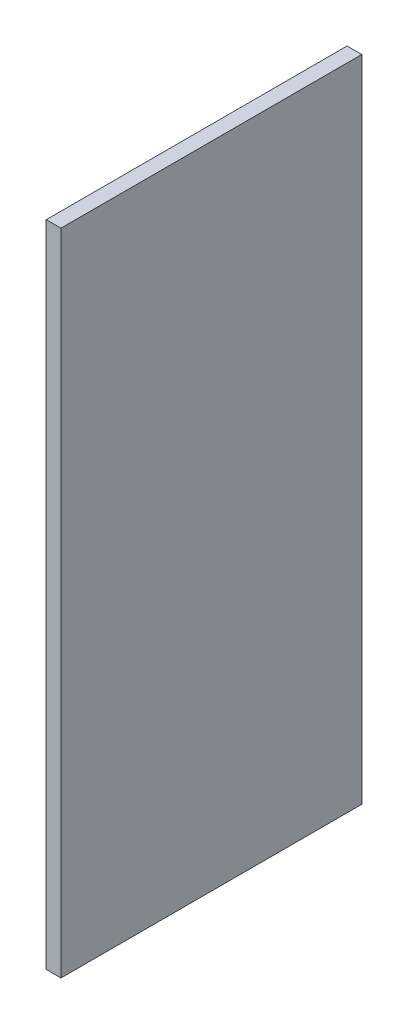
ISO-10303-21;
HEADER;
FILE_DESCRIPTION(('STEP AP214'),'2;1');
FILE_NAME('part.step','',(''),(''),'','','');
FILE_SCHEMA(('AUTOMOTIVE_DESIGN { 1 0 10303 214 1 1 1 1 }'));
ENDSEC;
DATA;
#1=APPLICATION_CONTEXT('core data for automotive mechanical design processes');
#2=APPLICATION_PROTOCOL_DEFINITION('international standard','automotive_design',2000,#1);
#3=PRODUCT_CONTEXT('',#1,'mechanical');
#4=PRODUCT('Part','Part','',(#3));
#5=PRODUCT_RELATED_PRODUCT_CATEGORY('part','',(#4));
#6=PRODUCT_DEFINITION_FORMATION('','',#4);
#7=PRODUCT_DEFINITION_CONTEXT('part definition',#1,'design');
#8=PRODUCT_DEFINITION('design','',#6,#7);
#9=PRODUCT_DEFINITION_SHAPE('','',#8);
#10=(LENGTH_UNIT() NAMED_UNIT(*) SI_UNIT(.MILLI.,.METRE.));
#11=(NAMED_UNIT(*) PLANE_ANGLE_UNIT() SI_UNIT($,.RADIAN.));
#12=(NAMED_UNIT(*) SI_UNIT($,.STERADIAN.) SOLID_ANGLE_UNIT());
#13=UNCERTAINTY_MEASURE_WITH_UNIT(LENGTH_MEASURE(1.E-05),#10,'distance_accuracy_value','');
#14=(GEOMETRIC_REPRESENTATION_CONTEXT(3) GLOBAL_UNCERTAINTY_ASSIGNED_CONTEXT((#13)) GLOBAL_UNIT_ASSIGNED_CONTEXT((#10,
#11,#12)) REPRESENTATION_CONTEXT('',''));
#15=CARTESIAN_POINT('',(0.,0.,0.));
#16=DIRECTION('',(0.,0.,1.));
#17=DIRECTION('',(1.,0.,0.));
#18=AXIS2_PLACEMENT_3D('',#15,#16,#17);
#19=CARTESIAN_POINT('',(658.5,201.5,-818.5));
#20=DIRECTION('',(-1.,0.,0.));
#21=DIRECTION('',(0.,0.,1.));
#22=AXIS2_PLACEMENT_3D('',#19,#20,#21);
#23=PLANE('',#22);
#24=DIRECTION('',(0.,-1.,0.));
#25=VECTOR('',#24,1.);
#26=CARTESIAN_POINT('',(658.5,201.5,0.));
#27=LINE('',#26,#25);
#28=CARTESIAN_POINT('',(658.5,1968.5,0.));
#29=VERTEX_POINT('',#28);
#30=CARTESIAN_POINT('',(658.5,201.5,0.));
#31=VERTEX_POINT('',#30);
#32=EDGE_CURVE('E103',#29,#31,#27,.T.);
#33=ORIENTED_EDGE('',*,*,#32,.F.);
#34=DIRECTION('',(0.,0.,1.));
#35=VECTOR('',#34,1.);
#36=CARTESIAN_POINT('',(658.5,1968.5,-818.5));
#37=LINE('',#36,#35);
#38=CARTESIAN_POINT('',(658.5,1968.5,-818.5));
#39=VERTEX_POINT('',#38);
#40=EDGE_CURVE('E11',#39,#29,#37,.T.);
#41=ORIENTED_EDGE('',*,*,#40,.F.);
#42=DIRECTION('',(0.,-1.,0.));
#43=VECTOR('',#42,1.);
#44=CARTESIAN_POINT('',(658.5,201.5,-818.5));
#45=LINE('',#44,#43);
#46=CARTESIAN_POINT('',(658.5,201.5,-818.5));
#47=VERTEX_POINT('',#46);
#48=EDGE_CURVE('E97',#39,#47,#45,.T.);
#49=ORIENTED_EDGE('',*,*,#48,.T.);
#50=DIRECTION('',(0.,0.,1.));
#51=VECTOR('',#50,1.);
#52=CARTESIAN_POINT('',(658.5,201.5,-818.5));
#53=LINE('',#52,#51);
#54=EDGE_CURVE('E42',#47,#31,#53,.T.);
#55=ORIENTED_EDGE('',*,*,#54,.T.);
#56=EDGE_LOOP('',(#33,#41,#49,#55));
#57=FACE_BOUND('',#56,.T.);
#58=ADVANCED_FACE('F39',(#57),#23,.T.);
#59=CARTESIAN_POINT('',(658.5,1968.5,-818.5));
#60=DIRECTION('',(0.,1.,0.));
#61=DIRECTION('',(0.,0.,1.));
#62=AXIS2_PLACEMENT_3D('',#59,#60,#61);
#63=PLANE('',#62);
#64=DIRECTION('',(-1.,0.,0.));
#65=VECTOR('',#64,1.);
#66=CARTESIAN_POINT('',(658.5,1968.5,0.));
#67=LINE('',#66,#65);
#68=CARTESIAN_POINT('',(698.5,1968.5,0.));
#69=VERTEX_POINT('',#68);
#70=EDGE_CURVE('E99',#69,#29,#67,.T.);
#71=ORIENTED_EDGE('',*,*,#70,.F.);
#72=DIRECTION('',(0.,0.,1.));
#73=VECTOR('',#72,1.);
#74=CARTESIAN_POINT('',(698.5,1968.5,-818.5));
#75=LINE('',#74,#73);
#76=CARTESIAN_POINT('',(698.5,1968.5,-818.5));
#77=VERTEX_POINT('',#76);
#78=EDGE_CURVE('E48',#77,#69,#75,.T.);
#79=ORIENTED_EDGE('',*,*,#78,.F.);
#80=DIRECTION('',(-1.,0.,0.));
#81=VECTOR('',#80,1.);
#82=CARTESIAN_POINT('',(658.5,1968.5,-818.5));
#83=LINE('',#82,#81);
#84=EDGE_CURVE('E94',#77,#39,#83,.T.);
#85=ORIENTED_EDGE('',*,*,#84,.T.);
#86=ORIENTED_EDGE('',*,*,#40,.T.);
#87=EDGE_LOOP('',(#71,#79,#85,#86));
#88=FACE_BOUND('',#87,.T.);
#89=ADVANCED_FACE('F113',(#88),#63,.T.);
#90=CARTESIAN_POINT('',(698.5,201.5,-818.5));
#91=DIRECTION('',(1.,0.,0.));
#92=DIRECTION('',(0.,0.,-1.));
#93=AXIS2_PLACEMENT_3D('',#90,#91,#92);
#94=PLANE('',#93);
#95=DIRECTION('',(0.,1.,0.));
#96=VECTOR('',#95,1.);
#97=CARTESIAN_POINT('',(698.5,201.5,0.));
#98=LINE('',#97,#96);
#99=CARTESIAN_POINT('',(698.5,201.5,0.));
#100=VERTEX_POINT('',#99);
#101=EDGE_CURVE('E89',#100,#69,#98,.T.);
#102=ORIENTED_EDGE('',*,*,#101,.F.);
#103=DIRECTION('',(0.,0.,1.));
#104=VECTOR('',#103,1.);
#105=CARTESIAN_POINT('',(698.5,201.5,-818.5));
#106=LINE('',#105,#104);
#107=CARTESIAN_POINT('',(698.5,201.5,-818.5));
#108=VERTEX_POINT('',#107);
#109=EDGE_CURVE('E84',#108,#100,#106,.T.);
#110=ORIENTED_EDGE('',*,*,#109,.F.);
#111=DIRECTION('',(0.,1.,0.));
#112=VECTOR('',#111,1.);
#113=CARTESIAN_POINT('',(698.5,201.5,-818.5));
#114=LINE('',#113,#112);
#115=EDGE_CURVE('E87',#108,#77,#114,.T.);
#116=ORIENTED_EDGE('',*,*,#115,.T.);
#117=ORIENTED_EDGE('',*,*,#78,.T.);
#118=EDGE_LOOP('',(#102,#110,#116,#117));
#119=FACE_BOUND('',#118,.T.);
#120=ADVANCED_FACE('F86',(#119),#94,.T.);
#121=CARTESIAN_POINT('',(658.5,201.5,-818.5));
#122=DIRECTION('',(0.,-1.,0.));
#123=DIRECTION('',(0.,0.,-1.));
#124=AXIS2_PLACEMENT_3D('',#121,#122,#123);
#125=PLANE('',#124);
#126=DIRECTION('',(1.,0.,0.));
#127=VECTOR('',#126,1.);
#128=CARTESIAN_POINT('',(658.5,201.5,0.));
#129=LINE('',#128,#127);
#130=EDGE_CURVE('E106',#31,#100,#129,.T.);
#131=ORIENTED_EDGE('',*,*,#130,.F.);
#132=ORIENTED_EDGE('',*,*,#54,.F.);
#133=DIRECTION('',(1.,0.,0.));
#134=VECTOR('',#133,1.);
#135=CARTESIAN_POINT('',(658.5,201.5,-818.5));
#136=LINE('',#135,#134);
#137=EDGE_CURVE('E93',#47,#108,#136,.T.);
#138=ORIENTED_EDGE('',*,*,#137,.T.);
#139=ORIENTED_EDGE('',*,*,#109,.T.);
#140=EDGE_LOOP('',(#131,#132,#138,#139));
#141=FACE_BOUND('',#140,.T.);
#142=ADVANCED_FACE('F96',(#141),#125,.T.);
#143=CARTESIAN_POINT('',(0.,0.,-818.5));
#144=DIRECTION('',(0.,0.,-1.));
#145=DIRECTION('',(-1.,0.,0.));
#146=AXIS2_PLACEMENT_3D('',#143,#144,#145);
#147=PLANE('',#146);
#148=ORIENTED_EDGE('',*,*,#48,.F.);
#149=ORIENTED_EDGE('',*,*,#84,.F.);
#150=ORIENTED_EDGE('',*,*,#115,.F.);
#151=ORIENTED_EDGE('',*,*,#137,.F.);
#152=EDGE_LOOP('',(#148,#149,#150,#151));
#153=FACE_BOUND('',#152,.T.);
#154=ADVANCED_FACE('F92',(#153),#147,.T.);
#155=CARTESIAN_POINT('',(0.,0.,0.));
#156=DIRECTION('',(0.,0.,-1.));
#157=DIRECTION('',(-1.,0.,0.));
#158=AXIS2_PLACEMENT_3D('',#155,#156,#157);
#159=PLANE('',#158);
#160=ORIENTED_EDGE('',*,*,#32,.T.);
#161=ORIENTED_EDGE('',*,*,#130,.T.);
#162=ORIENTED_EDGE('',*,*,#101,.T.);
#163=ORIENTED_EDGE('',*,*,#70,.T.);
#164=EDGE_LOOP('',(#160,#161,#162,#163));
#165=FACE_BOUND('',#164,.T.);
#166=ADVANCED_FACE('F112',(#165),#159,.F.);
#167=CLOSED_SHELL('',(#58,#89,#120,#142,#154,#166));
#168=MANIFOLD_SOLID_BREP('B2',#167);
#169=ADVANCED_BREP_SHAPE_REPRESENTATION('',(#18,#168),#14);
#170=SHAPE_DEFINITION_REPRESENTATION(#9,#169);
ENDSEC;
END-ISO-10303-21;
